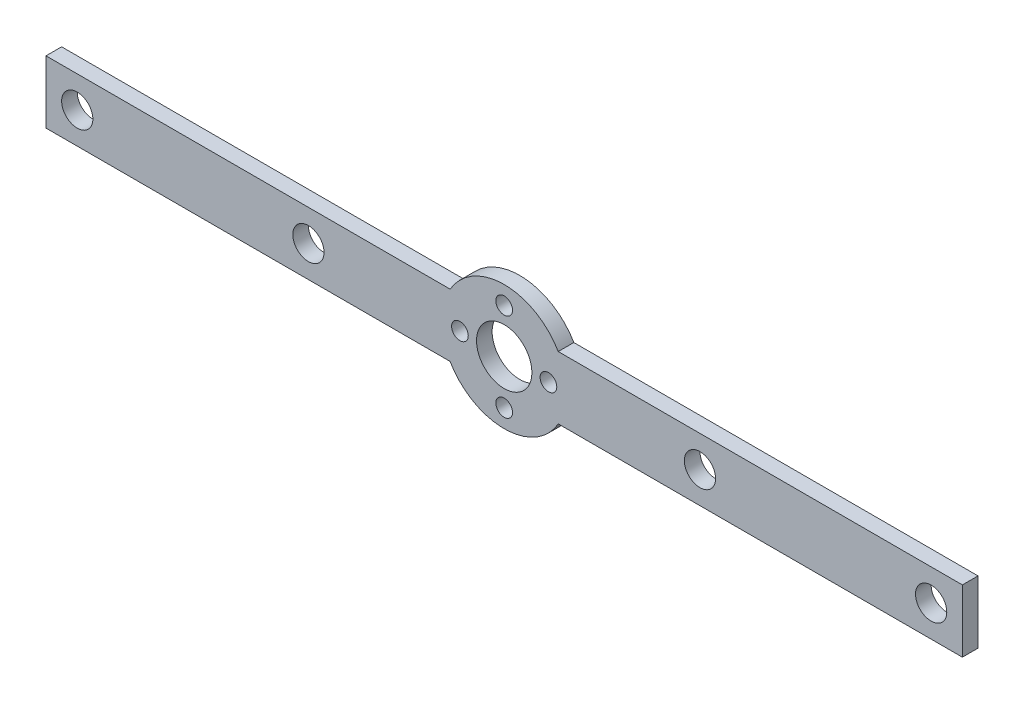
ISO-10303-21;
HEADER;
FILE_DESCRIPTION(('STEP AP214'),'2;1');
FILE_NAME('part.step','',(''),(''),'','','');
FILE_SCHEMA(('AUTOMOTIVE_DESIGN { 1 0 10303 214 1 1 1 1 }'));
ENDSEC;
DATA;
#1=APPLICATION_CONTEXT('core data for automotive mechanical design processes');
#2=APPLICATION_PROTOCOL_DEFINITION('international standard','automotive_design',2000,#1);
#3=PRODUCT_CONTEXT('',#1,'mechanical');
#4=PRODUCT('Part','Part','',(#3));
#5=PRODUCT_RELATED_PRODUCT_CATEGORY('part','',(#4));
#6=PRODUCT_DEFINITION_FORMATION('','',#4);
#7=PRODUCT_DEFINITION_CONTEXT('part definition',#1,'design');
#8=PRODUCT_DEFINITION('design','',#6,#7);
#9=PRODUCT_DEFINITION_SHAPE('','',#8);
#10=(LENGTH_UNIT() NAMED_UNIT(*) SI_UNIT(.MILLI.,.METRE.));
#11=(NAMED_UNIT(*) PLANE_ANGLE_UNIT() SI_UNIT($,.RADIAN.));
#12=(NAMED_UNIT(*) SI_UNIT($,.STERADIAN.) SOLID_ANGLE_UNIT());
#13=UNCERTAINTY_MEASURE_WITH_UNIT(LENGTH_MEASURE(1.E-05),#10,'distance_accuracy_value','');
#14=(GEOMETRIC_REPRESENTATION_CONTEXT(3) GLOBAL_UNCERTAINTY_ASSIGNED_CONTEXT((#13)) GLOBAL_UNIT_ASSIGNED_CONTEXT((#10,
#11,#12)) REPRESENTATION_CONTEXT('',''));
#15=CARTESIAN_POINT('',(0.,0.,0.));
#16=DIRECTION('',(0.,0.,1.));
#17=DIRECTION('',(1.,0.,0.));
#18=AXIS2_PLACEMENT_3D('',#15,#16,#17);
#19=CARTESIAN_POINT('',(0.,-19.,1.5));
#20=DIRECTION('',(0.,0.,1.));
#21=DIRECTION('',(1.,0.,0.));
#22=AXIS2_PLACEMENT_3D('',#19,#20,#21);
#23=PLANE('',#22);
#24=CARTESIAN_POINT('',(-18.8,-18.9999999999988,1.5));
#25=DIRECTION('',(0.,0.,1.));
#26=DIRECTION('',(1.,0.,0.));
#27=AXIS2_PLACEMENT_3D('',#24,#25,#26);
#28=CIRCLE('',#27,1.5);
#29=CARTESIAN_POINT('',(-17.3,-18.9999999999988,1.5));
#30=VERTEX_POINT('',#29);
#31=EDGE_CURVE('E226',#30,#30,#28,.T.);
#32=ORIENTED_EDGE('',*,*,#31,.F.);
#33=EDGE_LOOP('',(#32));
#34=FACE_BOUND('',#33,.T.);
#35=CARTESIAN_POINT('',(4.25,-19.,1.5));
#36=DIRECTION('',(0.,0.,1.));
#37=DIRECTION('',(1.,0.,0.));
#38=AXIS2_PLACEMENT_3D('',#35,#36,#37);
#39=CIRCLE('',#38,0.8);
#40=CARTESIAN_POINT('',(5.05,-19.,1.5));
#41=VERTEX_POINT('',#40);
#42=EDGE_CURVE('E214',#41,#41,#39,.T.);
#43=ORIENTED_EDGE('',*,*,#42,.F.);
#44=EDGE_LOOP('',(#43));
#45=FACE_BOUND('',#44,.T.);
#46=CARTESIAN_POINT('',(0.,-23.25,1.5));
#47=DIRECTION('',(0.,0.,1.));
#48=DIRECTION('',(1.,0.,0.));
#49=AXIS2_PLACEMENT_3D('',#46,#47,#48);
#50=CIRCLE('',#49,0.799999999999999);
#51=CARTESIAN_POINT('',(0.799999999999999,-23.25,1.5));
#52=VERTEX_POINT('',#51);
#53=EDGE_CURVE('E202',#52,#52,#50,.T.);
#54=ORIENTED_EDGE('',*,*,#53,.F.);
#55=EDGE_LOOP('',(#54));
#56=FACE_BOUND('',#55,.T.);
#57=CARTESIAN_POINT('',(41.,-19.0000000000001,1.5));
#58=DIRECTION('',(0.,0.,1.));
#59=DIRECTION('',(1.,0.,0.));
#60=AXIS2_PLACEMENT_3D('',#57,#58,#59);
#61=CIRCLE('',#60,1.5);
#62=CARTESIAN_POINT('',(42.5,-19.0000000000001,1.5));
#63=VERTEX_POINT('',#62);
#64=EDGE_CURVE('E190',#63,#63,#61,.T.);
#65=ORIENTED_EDGE('',*,*,#64,.F.);
#66=EDGE_LOOP('',(#65));
#67=FACE_BOUND('',#66,.T.);
#68=DIRECTION('',(0.,-1.,0.));
#69=VECTOR('',#68,1.);
#70=CARTESIAN_POINT('',(-43.9999999999998,-22.,1.5));
#71=LINE('',#70,#69);
#72=CARTESIAN_POINT('',(-43.9999999999998,-15.9866600757935,1.5));
#73=VERTEX_POINT('',#72);
#74=CARTESIAN_POINT('',(-43.9999999999998,-22.,1.5));
#75=VERTEX_POINT('',#74);
#76=EDGE_CURVE('E153',#73,#75,#71,.T.);
#77=ORIENTED_EDGE('',*,*,#76,.T.);
#78=DIRECTION('',(1.,0.,0.));
#79=VECTOR('',#78,1.);
#80=CARTESIAN_POINT('',(-43.9999999999998,-22.,1.5));
#81=LINE('',#80,#79);
#82=CARTESIAN_POINT('',(-5.19615242270666,-22.,1.5));
#83=VERTEX_POINT('',#82);
#84=EDGE_CURVE('E101',#75,#83,#81,.T.);
#85=ORIENTED_EDGE('',*,*,#84,.T.);
#86=CARTESIAN_POINT('',(0.,-19.,1.5));
#87=DIRECTION('',(0.,0.,1.));
#88=DIRECTION('',(1.,0.,0.));
#89=AXIS2_PLACEMENT_3D('',#86,#87,#88);
#90=CIRCLE('',#89,6.);
#91=CARTESIAN_POINT('',(5.19615242270666,-22.,1.5));
#92=VERTEX_POINT('',#91);
#93=EDGE_CURVE('E168',#83,#92,#90,.T.);
#94=ORIENTED_EDGE('',*,*,#93,.T.);
#95=DIRECTION('',(1.,0.,0.));
#96=VECTOR('',#95,1.);
#97=CARTESIAN_POINT('',(5.19615242270666,-22.,1.5));
#98=LINE('',#97,#96);
#99=CARTESIAN_POINT('',(44.0000000000001,-22.,1.5));
#100=VERTEX_POINT('',#99);
#101=EDGE_CURVE('E181',#92,#100,#98,.T.);
#102=ORIENTED_EDGE('',*,*,#101,.T.);
#103=DIRECTION('',(0.,1.,0.));
#104=VECTOR('',#103,1.);
#105=CARTESIAN_POINT('',(44.0000000000001,-22.,1.5));
#106=LINE('',#105,#104);
#107=CARTESIAN_POINT('',(44.0000000000001,-15.9866600757935,1.5));
#108=VERTEX_POINT('',#107);
#109=EDGE_CURVE('E120',#100,#108,#106,.T.);
#110=ORIENTED_EDGE('',*,*,#109,.T.);
#111=DIRECTION('',(-1.,0.,0.));
#112=VECTOR('',#111,1.);
#113=CARTESIAN_POINT('',(5.18842774847861,-15.9866600757935,1.5));
#114=LINE('',#113,#112);
#115=CARTESIAN_POINT('',(5.18842774847861,-15.9866600757935,1.5));
#116=VERTEX_POINT('',#115);
#117=EDGE_CURVE('E114',#108,#116,#114,.T.);
#118=ORIENTED_EDGE('',*,*,#117,.T.);
#119=CARTESIAN_POINT('',(0.,-19.,1.5));
#120=DIRECTION('',(0.,0.,1.));
#121=DIRECTION('',(1.,0.,0.));
#122=AXIS2_PLACEMENT_3D('',#119,#120,#121);
#123=CIRCLE('',#122,6.);
#124=CARTESIAN_POINT('',(-5.18842774847861,-15.9866600757935,1.5));
#125=VERTEX_POINT('',#124);
#126=EDGE_CURVE('E118',#116,#125,#123,.T.);
#127=ORIENTED_EDGE('',*,*,#126,.T.);
#128=DIRECTION('',(-1.,0.,0.));
#129=VECTOR('',#128,1.);
#130=CARTESIAN_POINT('',(-43.9999999999998,-15.9866600757935,1.5));
#131=LINE('',#130,#129);
#132=EDGE_CURVE('E58',#125,#73,#131,.T.);
#133=ORIENTED_EDGE('',*,*,#132,.T.);
#134=EDGE_LOOP('',(#77,#85,#94,#102,#110,#118,#127,#133));
#135=FACE_BOUND('',#134,.T.);
#136=CARTESIAN_POINT('',(0.,-14.75,1.5));
#137=DIRECTION('',(0.,0.,1.));
#138=DIRECTION('',(1.,0.,0.));
#139=AXIS2_PLACEMENT_3D('',#136,#137,#138);
#140=CIRCLE('',#139,0.8);
#141=CARTESIAN_POINT('',(0.8,-14.75,1.5));
#142=VERTEX_POINT('',#141);
#143=EDGE_CURVE('E142',#142,#142,#140,.T.);
#144=ORIENTED_EDGE('',*,*,#143,.F.);
#145=EDGE_LOOP('',(#144));
#146=FACE_BOUND('',#145,.T.);
#147=CARTESIAN_POINT('',(-40.9999999999998,-19.,1.5));
#148=DIRECTION('',(0.,0.,1.));
#149=DIRECTION('',(1.,0.,0.));
#150=AXIS2_PLACEMENT_3D('',#147,#148,#149);
#151=CIRCLE('',#150,1.5);
#152=CARTESIAN_POINT('',(-39.4999999999998,-19.,1.5));
#153=VERTEX_POINT('',#152);
#154=EDGE_CURVE('E196',#153,#153,#151,.T.);
#155=ORIENTED_EDGE('',*,*,#154,.F.);
#156=EDGE_LOOP('',(#155));
#157=FACE_BOUND('',#156,.T.);
#158=CARTESIAN_POINT('',(0.,-19.,1.5));
#159=DIRECTION('',(0.,0.,1.));
#160=DIRECTION('',(1.,0.,0.));
#161=AXIS2_PLACEMENT_3D('',#158,#159,#160);
#162=CIRCLE('',#161,2.66);
#163=CARTESIAN_POINT('',(2.66,-19.,1.5));
#164=VERTEX_POINT('',#163);
#165=EDGE_CURVE('E208',#164,#164,#162,.T.);
#166=ORIENTED_EDGE('',*,*,#165,.F.);
#167=EDGE_LOOP('',(#166));
#168=FACE_BOUND('',#167,.T.);
#169=CARTESIAN_POINT('',(-4.25,-19.,1.5));
#170=DIRECTION('',(0.,0.,1.));
#171=DIRECTION('',(1.,0.,0.));
#172=AXIS2_PLACEMENT_3D('',#169,#170,#171);
#173=CIRCLE('',#172,0.799999999999999);
#174=CARTESIAN_POINT('',(-3.45,-19.,1.5));
#175=VERTEX_POINT('',#174);
#176=EDGE_CURVE('E220',#175,#175,#173,.T.);
#177=ORIENTED_EDGE('',*,*,#176,.F.);
#178=EDGE_LOOP('',(#177));
#179=FACE_BOUND('',#178,.T.);
#180=CARTESIAN_POINT('',(18.8,-18.9999999999987,1.5));
#181=DIRECTION('',(0.,0.,1.));
#182=DIRECTION('',(1.,0.,0.));
#183=AXIS2_PLACEMENT_3D('',#180,#181,#182);
#184=CIRCLE('',#183,1.5);
#185=CARTESIAN_POINT('',(20.3,-18.9999999999987,1.5));
#186=VERTEX_POINT('',#185);
#187=EDGE_CURVE('E232',#186,#186,#184,.T.);
#188=ORIENTED_EDGE('',*,*,#187,.F.);
#189=EDGE_LOOP('',(#188));
#190=FACE_BOUND('',#189,.T.);
#191=ADVANCED_FACE('F41',(#34,#45,#56,#67,#135,#146,#157,#168,#179,#190),#23,.T.);
#192=CARTESIAN_POINT('',(0.,-19.,0.));
#193=DIRECTION('',(0.,0.,1.));
#194=DIRECTION('',(1.,0.,0.));
#195=AXIS2_PLACEMENT_3D('',#192,#193,#194);
#196=PLANE('',#195);
#197=DIRECTION('',(0.,-1.,0.));
#198=VECTOR('',#197,1.);
#199=CARTESIAN_POINT('',(-43.9999999999998,-22.,0.));
#200=LINE('',#199,#198);
#201=CARTESIAN_POINT('',(-43.9999999999998,-15.9866600757935,0.));
#202=VERTEX_POINT('',#201);
#203=CARTESIAN_POINT('',(-43.9999999999998,-22.,0.));
#204=VERTEX_POINT('',#203);
#205=EDGE_CURVE('E138',#202,#204,#200,.T.);
#206=ORIENTED_EDGE('',*,*,#205,.F.);
#207=DIRECTION('',(-1.,0.,0.));
#208=VECTOR('',#207,1.);
#209=CARTESIAN_POINT('',(-43.9999999999998,-15.9866600757935,0.));
#210=LINE('',#209,#208);
#211=CARTESIAN_POINT('',(-5.18842774847861,-15.9866600757935,0.));
#212=VERTEX_POINT('',#211);
#213=EDGE_CURVE('E93',#212,#202,#210,.T.);
#214=ORIENTED_EDGE('',*,*,#213,.F.);
#215=CARTESIAN_POINT('',(0.,-19.,0.));
#216=DIRECTION('',(0.,0.,1.));
#217=DIRECTION('',(1.,0.,0.));
#218=AXIS2_PLACEMENT_3D('',#215,#216,#217);
#219=CIRCLE('',#218,6.);
#220=CARTESIAN_POINT('',(5.18842774847861,-15.9866600757935,0.));
#221=VERTEX_POINT('',#220);
#222=EDGE_CURVE('E87',#221,#212,#219,.T.);
#223=ORIENTED_EDGE('',*,*,#222,.F.);
#224=DIRECTION('',(-1.,0.,0.));
#225=VECTOR('',#224,1.);
#226=CARTESIAN_POINT('',(5.18842774847861,-15.9866600757935,0.));
#227=LINE('',#226,#225);
#228=CARTESIAN_POINT('',(44.0000000000001,-15.9866600757935,0.));
#229=VERTEX_POINT('',#228);
#230=EDGE_CURVE('E128',#229,#221,#227,.T.);
#231=ORIENTED_EDGE('',*,*,#230,.F.);
#232=DIRECTION('',(0.,1.,0.));
#233=VECTOR('',#232,1.);
#234=CARTESIAN_POINT('',(44.0000000000001,-22.,0.));
#235=LINE('',#234,#233);
#236=CARTESIAN_POINT('',(44.0000000000001,-22.,0.));
#237=VERTEX_POINT('',#236);
#238=EDGE_CURVE('E148',#237,#229,#235,.T.);
#239=ORIENTED_EDGE('',*,*,#238,.F.);
#240=DIRECTION('',(1.,0.,0.));
#241=VECTOR('',#240,1.);
#242=CARTESIAN_POINT('',(5.19615242270666,-22.,0.));
#243=LINE('',#242,#241);
#244=CARTESIAN_POINT('',(5.19615242270666,-22.,0.));
#245=VERTEX_POINT('',#244);
#246=EDGE_CURVE('E146',#245,#237,#243,.T.);
#247=ORIENTED_EDGE('',*,*,#246,.F.);
#248=CARTESIAN_POINT('',(0.,-19.,0.));
#249=DIRECTION('',(0.,0.,1.));
#250=DIRECTION('',(1.,0.,0.));
#251=AXIS2_PLACEMENT_3D('',#248,#249,#250);
#252=CIRCLE('',#251,6.);
#253=CARTESIAN_POINT('',(-5.19615242270666,-22.,0.));
#254=VERTEX_POINT('',#253);
#255=EDGE_CURVE('E144',#254,#245,#252,.T.);
#256=ORIENTED_EDGE('',*,*,#255,.F.);
#257=DIRECTION('',(1.,0.,0.));
#258=VECTOR('',#257,1.);
#259=CARTESIAN_POINT('',(-43.9999999999998,-22.,0.));
#260=LINE('',#259,#258);
#261=EDGE_CURVE('E141',#204,#254,#260,.T.);
#262=ORIENTED_EDGE('',*,*,#261,.F.);
#263=EDGE_LOOP('',(#206,#214,#223,#231,#239,#247,#256,#262));
#264=FACE_BOUND('',#263,.T.);
#265=CARTESIAN_POINT('',(0.,-14.75,0.));
#266=DIRECTION('',(0.,0.,1.));
#267=DIRECTION('',(1.,0.,0.));
#268=AXIS2_PLACEMENT_3D('',#265,#266,#267);
#269=CIRCLE('',#268,0.8);
#270=CARTESIAN_POINT('',(0.8,-14.75,0.));
#271=VERTEX_POINT('',#270);
#272=EDGE_CURVE('E187',#271,#271,#269,.T.);
#273=ORIENTED_EDGE('',*,*,#272,.T.);
#274=EDGE_LOOP('',(#273));
#275=FACE_BOUND('',#274,.T.);
#276=CARTESIAN_POINT('',(41.,-19.0000000000001,0.));
#277=DIRECTION('',(0.,0.,1.));
#278=DIRECTION('',(1.,0.,0.));
#279=AXIS2_PLACEMENT_3D('',#276,#277,#278);
#280=CIRCLE('',#279,1.5);
#281=CARTESIAN_POINT('',(42.5,-19.0000000000001,0.));
#282=VERTEX_POINT('',#281);
#283=EDGE_CURVE('E193',#282,#282,#280,.T.);
#284=ORIENTED_EDGE('',*,*,#283,.T.);
#285=EDGE_LOOP('',(#284));
#286=FACE_BOUND('',#285,.T.);
#287=CARTESIAN_POINT('',(-40.9999999999998,-19.,0.));
#288=DIRECTION('',(0.,0.,1.));
#289=DIRECTION('',(1.,0.,0.));
#290=AXIS2_PLACEMENT_3D('',#287,#288,#289);
#291=CIRCLE('',#290,1.5);
#292=CARTESIAN_POINT('',(-39.4999999999998,-19.,0.));
#293=VERTEX_POINT('',#292);
#294=EDGE_CURVE('E199',#293,#293,#291,.T.);
#295=ORIENTED_EDGE('',*,*,#294,.T.);
#296=EDGE_LOOP('',(#295));
#297=FACE_BOUND('',#296,.T.);
#298=CARTESIAN_POINT('',(0.,-23.25,0.));
#299=DIRECTION('',(0.,0.,1.));
#300=DIRECTION('',(1.,0.,0.));
#301=AXIS2_PLACEMENT_3D('',#298,#299,#300);
#302=CIRCLE('',#301,0.799999999999999);
#303=CARTESIAN_POINT('',(0.799999999999999,-23.25,0.));
#304=VERTEX_POINT('',#303);
#305=EDGE_CURVE('E205',#304,#304,#302,.T.);
#306=ORIENTED_EDGE('',*,*,#305,.T.);
#307=EDGE_LOOP('',(#306));
#308=FACE_BOUND('',#307,.T.);
#309=CARTESIAN_POINT('',(0.,-19.,0.));
#310=DIRECTION('',(0.,0.,1.));
#311=DIRECTION('',(1.,0.,0.));
#312=AXIS2_PLACEMENT_3D('',#309,#310,#311);
#313=CIRCLE('',#312,2.66);
#314=CARTESIAN_POINT('',(2.66,-19.,0.));
#315=VERTEX_POINT('',#314);
#316=EDGE_CURVE('E211',#315,#315,#313,.T.);
#317=ORIENTED_EDGE('',*,*,#316,.T.);
#318=EDGE_LOOP('',(#317));
#319=FACE_BOUND('',#318,.T.);
#320=CARTESIAN_POINT('',(4.25,-19.,0.));
#321=DIRECTION('',(0.,0.,1.));
#322=DIRECTION('',(1.,0.,0.));
#323=AXIS2_PLACEMENT_3D('',#320,#321,#322);
#324=CIRCLE('',#323,0.8);
#325=CARTESIAN_POINT('',(5.05,-19.,0.));
#326=VERTEX_POINT('',#325);
#327=EDGE_CURVE('E217',#326,#326,#324,.T.);
#328=ORIENTED_EDGE('',*,*,#327,.T.);
#329=EDGE_LOOP('',(#328));
#330=FACE_BOUND('',#329,.T.);
#331=CARTESIAN_POINT('',(-4.25,-19.,0.));
#332=DIRECTION('',(0.,0.,1.));
#333=DIRECTION('',(1.,0.,0.));
#334=AXIS2_PLACEMENT_3D('',#331,#332,#333);
#335=CIRCLE('',#334,0.799999999999999);
#336=CARTESIAN_POINT('',(-3.45,-19.,0.));
#337=VERTEX_POINT('',#336);
#338=EDGE_CURVE('E223',#337,#337,#335,.T.);
#339=ORIENTED_EDGE('',*,*,#338,.T.);
#340=EDGE_LOOP('',(#339));
#341=FACE_BOUND('',#340,.T.);
#342=CARTESIAN_POINT('',(-18.8,-18.9999999999988,0.));
#343=DIRECTION('',(0.,0.,1.));
#344=DIRECTION('',(1.,0.,0.));
#345=AXIS2_PLACEMENT_3D('',#342,#343,#344);
#346=CIRCLE('',#345,1.5);
#347=CARTESIAN_POINT('',(-17.3,-18.9999999999988,0.));
#348=VERTEX_POINT('',#347);
#349=EDGE_CURVE('E229',#348,#348,#346,.T.);
#350=ORIENTED_EDGE('',*,*,#349,.T.);
#351=EDGE_LOOP('',(#350));
#352=FACE_BOUND('',#351,.T.);
#353=CARTESIAN_POINT('',(18.8,-18.9999999999987,0.));
#354=DIRECTION('',(0.,0.,1.));
#355=DIRECTION('',(1.,0.,0.));
#356=AXIS2_PLACEMENT_3D('',#353,#354,#355);
#357=CIRCLE('',#356,1.5);
#358=CARTESIAN_POINT('',(20.3,-18.9999999999987,0.));
#359=VERTEX_POINT('',#358);
#360=EDGE_CURVE('E235',#359,#359,#357,.T.);
#361=ORIENTED_EDGE('',*,*,#360,.T.);
#362=EDGE_LOOP('',(#361));
#363=FACE_BOUND('',#362,.T.);
#364=ADVANCED_FACE('F172',(#264,#275,#286,#297,#308,#319,#330,#341,#352,#363),#196,.F.);
#365=CARTESIAN_POINT('',(-43.9999999999998,-22.,1.5));
#366=DIRECTION('',(1.,0.,0.));
#367=DIRECTION('',(0.,0.,-1.));
#368=AXIS2_PLACEMENT_3D('',#365,#366,#367);
#369=PLANE('',#368);
#370=ORIENTED_EDGE('',*,*,#205,.T.);
#371=DIRECTION('',(0.,0.,-1.));
#372=VECTOR('',#371,1.);
#373=CARTESIAN_POINT('',(-43.9999999999998,-22.,1.5));
#374=LINE('',#373,#372);
#375=EDGE_CURVE('E11',#75,#204,#374,.T.);
#376=ORIENTED_EDGE('',*,*,#375,.F.);
#377=ORIENTED_EDGE('',*,*,#76,.F.);
#378=DIRECTION('',(0.,0.,-1.));
#379=VECTOR('',#378,1.);
#380=CARTESIAN_POINT('',(-43.9999999999998,-15.9866600757935,1.5));
#381=LINE('',#380,#379);
#382=EDGE_CURVE('E134',#73,#202,#381,.T.);
#383=ORIENTED_EDGE('',*,*,#382,.T.);
#384=EDGE_LOOP('',(#370,#376,#377,#383));
#385=FACE_BOUND('',#384,.T.);
#386=ADVANCED_FACE('F43',(#385),#369,.F.);
#387=CARTESIAN_POINT('',(-43.9999999999998,-22.,1.5));
#388=DIRECTION('',(0.,1.,0.));
#389=DIRECTION('',(0.,0.,1.));
#390=AXIS2_PLACEMENT_3D('',#387,#388,#389);
#391=PLANE('',#390);
#392=ORIENTED_EDGE('',*,*,#261,.T.);
#393=DIRECTION('',(0.,0.,-1.));
#394=VECTOR('',#393,1.);
#395=CARTESIAN_POINT('',(-5.19615242270666,-22.,1.5));
#396=LINE('',#395,#394);
#397=EDGE_CURVE('E50',#83,#254,#396,.T.);
#398=ORIENTED_EDGE('',*,*,#397,.F.);
#399=ORIENTED_EDGE('',*,*,#84,.F.);
#400=ORIENTED_EDGE('',*,*,#375,.T.);
#401=EDGE_LOOP('',(#392,#398,#399,#400));
#402=FACE_BOUND('',#401,.T.);
#403=ADVANCED_FACE('F269',(#402),#391,.F.);
#404=CARTESIAN_POINT('',(0.,-19.,1.5));
#405=DIRECTION('',(0.,0.,-1.));
#406=DIRECTION('',(-1.,0.,0.));
#407=AXIS2_PLACEMENT_3D('',#404,#405,#406);
#408=CYLINDRICAL_SURFACE('',#407,6.);
#409=ORIENTED_EDGE('',*,*,#255,.T.);
#410=DIRECTION('',(0.,0.,-1.));
#411=VECTOR('',#410,1.);
#412=CARTESIAN_POINT('',(5.19615242270666,-22.,1.5));
#413=LINE('',#412,#411);
#414=EDGE_CURVE('E160',#92,#245,#413,.T.);
#415=ORIENTED_EDGE('',*,*,#414,.F.);
#416=ORIENTED_EDGE('',*,*,#93,.F.);
#417=ORIENTED_EDGE('',*,*,#397,.T.);
#418=EDGE_LOOP('',(#409,#415,#416,#417));
#419=FACE_BOUND('',#418,.T.);
#420=ADVANCED_FACE('F166',(#419),#408,.T.);
#421=CARTESIAN_POINT('',(5.19615242270666,-22.,1.5));
#422=DIRECTION('',(0.,1.,0.));
#423=DIRECTION('',(0.,0.,1.));
#424=AXIS2_PLACEMENT_3D('',#421,#422,#423);
#425=PLANE('',#424);
#426=ORIENTED_EDGE('',*,*,#246,.T.);
#427=DIRECTION('',(0.,0.,-1.));
#428=VECTOR('',#427,1.);
#429=CARTESIAN_POINT('',(44.0000000000001,-22.,1.5));
#430=LINE('',#429,#428);
#431=EDGE_CURVE('E157',#100,#237,#430,.T.);
#432=ORIENTED_EDGE('',*,*,#431,.F.);
#433=ORIENTED_EDGE('',*,*,#101,.F.);
#434=ORIENTED_EDGE('',*,*,#414,.T.);
#435=EDGE_LOOP('',(#426,#432,#433,#434));
#436=FACE_BOUND('',#435,.T.);
#437=ADVANCED_FACE('F177',(#436),#425,.F.);
#438=CARTESIAN_POINT('',(44.0000000000001,-22.,1.5));
#439=DIRECTION('',(-1.,0.,0.));
#440=DIRECTION('',(0.,0.,1.));
#441=AXIS2_PLACEMENT_3D('',#438,#439,#440);
#442=PLANE('',#441);
#443=ORIENTED_EDGE('',*,*,#238,.T.);
#444=DIRECTION('',(0.,0.,-1.));
#445=VECTOR('',#444,1.);
#446=CARTESIAN_POINT('',(44.0000000000001,-15.9866600757935,1.5));
#447=LINE('',#446,#445);
#448=EDGE_CURVE('E129',#108,#229,#447,.T.);
#449=ORIENTED_EDGE('',*,*,#448,.F.);
#450=ORIENTED_EDGE('',*,*,#109,.F.);
#451=ORIENTED_EDGE('',*,*,#431,.T.);
#452=EDGE_LOOP('',(#443,#449,#450,#451));
#453=FACE_BOUND('',#452,.T.);
#454=ADVANCED_FACE('F180',(#453),#442,.F.);
#455=CARTESIAN_POINT('',(5.18842774847861,-15.9866600757935,1.5));
#456=DIRECTION('',(0.,-1.,0.));
#457=DIRECTION('',(0.,0.,-1.));
#458=AXIS2_PLACEMENT_3D('',#455,#456,#457);
#459=PLANE('',#458);
#460=ORIENTED_EDGE('',*,*,#230,.T.);
#461=DIRECTION('',(0.,0.,-1.));
#462=VECTOR('',#461,1.);
#463=CARTESIAN_POINT('',(5.18842774847861,-15.9866600757935,1.5));
#464=LINE('',#463,#462);
#465=EDGE_CURVE('E125',#116,#221,#464,.T.);
#466=ORIENTED_EDGE('',*,*,#465,.F.);
#467=ORIENTED_EDGE('',*,*,#117,.F.);
#468=ORIENTED_EDGE('',*,*,#448,.T.);
#469=EDGE_LOOP('',(#460,#466,#467,#468));
#470=FACE_BOUND('',#469,.T.);
#471=ADVANCED_FACE('F126',(#470),#459,.F.);
#472=CARTESIAN_POINT('',(0.,-19.,1.5));
#473=DIRECTION('',(0.,0.,-1.));
#474=DIRECTION('',(-1.,0.,0.));
#475=AXIS2_PLACEMENT_3D('',#472,#473,#474);
#476=CYLINDRICAL_SURFACE('',#475,6.);
#477=ORIENTED_EDGE('',*,*,#222,.T.);
#478=DIRECTION('',(0.,0.,-1.));
#479=VECTOR('',#478,1.);
#480=CARTESIAN_POINT('',(-5.18842774847861,-15.9866600757935,1.5));
#481=LINE('',#480,#479);
#482=EDGE_CURVE('E130',#125,#212,#481,.T.);
#483=ORIENTED_EDGE('',*,*,#482,.F.);
#484=ORIENTED_EDGE('',*,*,#126,.F.);
#485=ORIENTED_EDGE('',*,*,#465,.T.);
#486=EDGE_LOOP('',(#477,#483,#484,#485));
#487=FACE_BOUND('',#486,.T.);
#488=ADVANCED_FACE('F132',(#487),#476,.T.);
#489=CARTESIAN_POINT('',(-43.9999999999998,-15.9866600757935,1.5));
#490=DIRECTION('',(0.,-1.,0.));
#491=DIRECTION('',(0.,0.,-1.));
#492=AXIS2_PLACEMENT_3D('',#489,#490,#491);
#493=PLANE('',#492);
#494=ORIENTED_EDGE('',*,*,#213,.T.);
#495=ORIENTED_EDGE('',*,*,#382,.F.);
#496=ORIENTED_EDGE('',*,*,#132,.F.);
#497=ORIENTED_EDGE('',*,*,#482,.T.);
#498=EDGE_LOOP('',(#494,#495,#496,#497));
#499=FACE_BOUND('',#498,.T.);
#500=ADVANCED_FACE('F257',(#499),#493,.F.);
#501=CARTESIAN_POINT('',(0.,-14.75,1.5));
#502=DIRECTION('',(0.,0.,-1.));
#503=DIRECTION('',(-1.,0.,0.));
#504=AXIS2_PLACEMENT_3D('',#501,#502,#503);
#505=CYLINDRICAL_SURFACE('',#504,0.8);
#506=ORIENTED_EDGE('',*,*,#143,.T.);
#507=EDGE_LOOP('',(#506));
#508=FACE_BOUND('',#507,.T.);
#509=ORIENTED_EDGE('',*,*,#272,.F.);
#510=EDGE_LOOP('',(#509));
#511=FACE_BOUND('',#510,.T.);
#512=ADVANCED_FACE('F254',(#508,#511),#505,.F.);
#513=CARTESIAN_POINT('',(41.,-19.0000000000001,1.5));
#514=DIRECTION('',(0.,0.,-1.));
#515=DIRECTION('',(-1.,0.,0.));
#516=AXIS2_PLACEMENT_3D('',#513,#514,#515);
#517=CYLINDRICAL_SURFACE('',#516,1.5);
#518=ORIENTED_EDGE('',*,*,#64,.T.);
#519=EDGE_LOOP('',(#518));
#520=FACE_BOUND('',#519,.T.);
#521=ORIENTED_EDGE('',*,*,#283,.F.);
#522=EDGE_LOOP('',(#521));
#523=FACE_BOUND('',#522,.T.);
#524=ADVANCED_FACE('F332',(#520,#523),#517,.F.);
#525=CARTESIAN_POINT('',(-40.9999999999998,-19.,1.5));
#526=DIRECTION('',(0.,0.,-1.));
#527=DIRECTION('',(-1.,0.,0.));
#528=AXIS2_PLACEMENT_3D('',#525,#526,#527);
#529=CYLINDRICAL_SURFACE('',#528,1.5);
#530=ORIENTED_EDGE('',*,*,#154,.T.);
#531=EDGE_LOOP('',(#530));
#532=FACE_BOUND('',#531,.T.);
#533=ORIENTED_EDGE('',*,*,#294,.F.);
#534=EDGE_LOOP('',(#533));
#535=FACE_BOUND('',#534,.T.);
#536=ADVANCED_FACE('F340',(#532,#535),#529,.F.);
#537=CARTESIAN_POINT('',(0.,-23.25,1.5));
#538=DIRECTION('',(0.,0.,-1.));
#539=DIRECTION('',(-1.,0.,0.));
#540=AXIS2_PLACEMENT_3D('',#537,#538,#539);
#541=CYLINDRICAL_SURFACE('',#540,0.799999999999999);
#542=ORIENTED_EDGE('',*,*,#53,.T.);
#543=EDGE_LOOP('',(#542));
#544=FACE_BOUND('',#543,.T.);
#545=ORIENTED_EDGE('',*,*,#305,.F.);
#546=EDGE_LOOP('',(#545));
#547=FACE_BOUND('',#546,.T.);
#548=ADVANCED_FACE('F348',(#544,#547),#541,.F.);
#549=CARTESIAN_POINT('',(0.,-19.,1.5));
#550=DIRECTION('',(0.,0.,-1.));
#551=DIRECTION('',(-1.,0.,0.));
#552=AXIS2_PLACEMENT_3D('',#549,#550,#551);
#553=CYLINDRICAL_SURFACE('',#552,2.66);
#554=ORIENTED_EDGE('',*,*,#165,.T.);
#555=EDGE_LOOP('',(#554));
#556=FACE_BOUND('',#555,.T.);
#557=ORIENTED_EDGE('',*,*,#316,.F.);
#558=EDGE_LOOP('',(#557));
#559=FACE_BOUND('',#558,.T.);
#560=ADVANCED_FACE('F357',(#556,#559),#553,.F.);
#561=CARTESIAN_POINT('',(4.25,-19.,1.5));
#562=DIRECTION('',(0.,0.,-1.));
#563=DIRECTION('',(-1.,0.,0.));
#564=AXIS2_PLACEMENT_3D('',#561,#562,#563);
#565=CYLINDRICAL_SURFACE('',#564,0.8);
#566=ORIENTED_EDGE('',*,*,#42,.T.);
#567=EDGE_LOOP('',(#566));
#568=FACE_BOUND('',#567,.T.);
#569=ORIENTED_EDGE('',*,*,#327,.F.);
#570=EDGE_LOOP('',(#569));
#571=FACE_BOUND('',#570,.T.);
#572=ADVANCED_FACE('F366',(#568,#571),#565,.F.);
#573=CARTESIAN_POINT('',(-4.25,-19.,1.5));
#574=DIRECTION('',(0.,0.,-1.));
#575=DIRECTION('',(-1.,0.,0.));
#576=AXIS2_PLACEMENT_3D('',#573,#574,#575);
#577=CYLINDRICAL_SURFACE('',#576,0.799999999999999);
#578=ORIENTED_EDGE('',*,*,#176,.T.);
#579=EDGE_LOOP('',(#578));
#580=FACE_BOUND('',#579,.T.);
#581=ORIENTED_EDGE('',*,*,#338,.F.);
#582=EDGE_LOOP('',(#581));
#583=FACE_BOUND('',#582,.T.);
#584=ADVANCED_FACE('F375',(#580,#583),#577,.F.);
#585=CARTESIAN_POINT('',(-18.8,-18.9999999999988,1.5));
#586=DIRECTION('',(0.,0.,-1.));
#587=DIRECTION('',(-1.,0.,0.));
#588=AXIS2_PLACEMENT_3D('',#585,#586,#587);
#589=CYLINDRICAL_SURFACE('',#588,1.5);
#590=ORIENTED_EDGE('',*,*,#31,.T.);
#591=EDGE_LOOP('',(#590));
#592=FACE_BOUND('',#591,.T.);
#593=ORIENTED_EDGE('',*,*,#349,.F.);
#594=EDGE_LOOP('',(#593));
#595=FACE_BOUND('',#594,.T.);
#596=ADVANCED_FACE('F384',(#592,#595),#589,.F.);
#597=CARTESIAN_POINT('',(18.8,-18.9999999999987,1.5));
#598=DIRECTION('',(0.,0.,-1.));
#599=DIRECTION('',(-1.,0.,0.));
#600=AXIS2_PLACEMENT_3D('',#597,#598,#599);
#601=CYLINDRICAL_SURFACE('',#600,1.5);
#602=ORIENTED_EDGE('',*,*,#187,.T.);
#603=EDGE_LOOP('',(#602));
#604=FACE_BOUND('',#603,.T.);
#605=ORIENTED_EDGE('',*,*,#360,.F.);
#606=EDGE_LOOP('',(#605));
#607=FACE_BOUND('',#606,.T.);
#608=ADVANCED_FACE('F241',(#604,#607),#601,.F.);
#609=CLOSED_SHELL('',(#191,#364,#386,#403,#420,#437,#454,#471,#488,#500,#512,#524,#536,#548,
#560,#572,#584,#596,#608));
#610=MANIFOLD_SOLID_BREP('B2',#609);
#611=ADVANCED_BREP_SHAPE_REPRESENTATION('',(#18,#610),#14);
#612=SHAPE_DEFINITION_REPRESENTATION(#9,#611);
ENDSEC;
END-ISO-10303-21;
